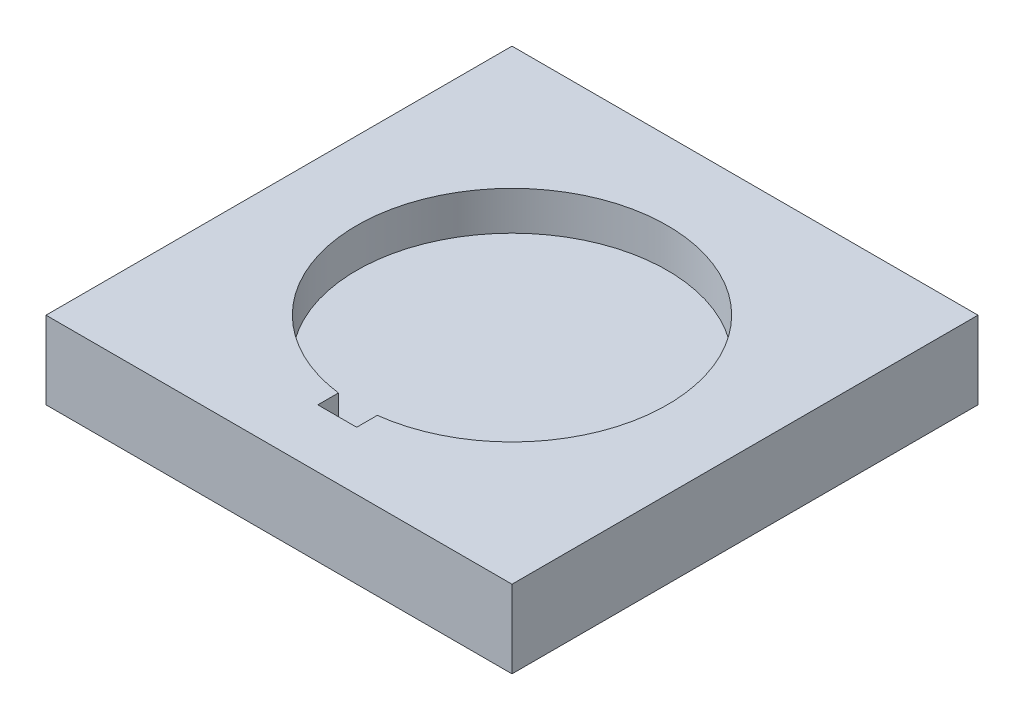
ISO-10303-21;
HEADER;
FILE_DESCRIPTION(('STEP AP214'),'2;1');
FILE_NAME('part.step','',(''),(''),'','','');
FILE_SCHEMA(('AUTOMOTIVE_DESIGN { 1 0 10303 214 1 1 1 1 }'));
ENDSEC;
DATA;
#1=APPLICATION_CONTEXT('core data for automotive mechanical design processes');
#2=APPLICATION_PROTOCOL_DEFINITION('international standard','automotive_design',2000,#1);
#3=PRODUCT_CONTEXT('',#1,'mechanical');
#4=PRODUCT('Part','Part','',(#3));
#5=PRODUCT_RELATED_PRODUCT_CATEGORY('part','',(#4));
#6=PRODUCT_DEFINITION_FORMATION('','',#4);
#7=PRODUCT_DEFINITION_CONTEXT('part definition',#1,'design');
#8=PRODUCT_DEFINITION('design','',#6,#7);
#9=PRODUCT_DEFINITION_SHAPE('','',#8);
#10=(LENGTH_UNIT() NAMED_UNIT(*) SI_UNIT(.MILLI.,.METRE.));
#11=(NAMED_UNIT(*) PLANE_ANGLE_UNIT() SI_UNIT($,.RADIAN.));
#12=(NAMED_UNIT(*) SI_UNIT($,.STERADIAN.) SOLID_ANGLE_UNIT());
#13=UNCERTAINTY_MEASURE_WITH_UNIT(LENGTH_MEASURE(1.E-05),#10,'distance_accuracy_value','');
#14=(GEOMETRIC_REPRESENTATION_CONTEXT(3) GLOBAL_UNCERTAINTY_ASSIGNED_CONTEXT((#13)) GLOBAL_UNIT_ASSIGNED_CONTEXT((#10,
#11,#12)) REPRESENTATION_CONTEXT('',''));
#15=CARTESIAN_POINT('',(0.,0.,0.));
#16=DIRECTION('',(0.,0.,1.));
#17=DIRECTION('',(1.,0.,0.));
#18=AXIS2_PLACEMENT_3D('',#15,#16,#17);
#19=CARTESIAN_POINT('',(-76.2,-25.4,-76.2));
#20=DIRECTION('',(-1.,0.,0.));
#21=DIRECTION('',(0.,0.,1.));
#22=AXIS2_PLACEMENT_3D('',#19,#20,#21);
#23=PLANE('',#22);
#24=DIRECTION('',(0.,0.,1.));
#25=VECTOR('',#24,1.);
#26=CARTESIAN_POINT('',(-76.2,0.,-76.2));
#27=LINE('',#26,#25);
#28=CARTESIAN_POINT('',(-76.2,0.,-76.2));
#29=VERTEX_POINT('',#28);
#30=CARTESIAN_POINT('',(-76.2,0.,76.2));
#31=VERTEX_POINT('',#30);
#32=EDGE_CURVE('E139',#29,#31,#27,.T.);
#33=ORIENTED_EDGE('',*,*,#32,.F.);
#34=DIRECTION('',(0.,1.,0.));
#35=VECTOR('',#34,1.);
#36=CARTESIAN_POINT('',(-76.2,-25.4,-76.2));
#37=LINE('',#36,#35);
#38=CARTESIAN_POINT('',(-76.2,-25.4,-76.2));
#39=VERTEX_POINT('',#38);
#40=EDGE_CURVE('E11',#39,#29,#37,.T.);
#41=ORIENTED_EDGE('',*,*,#40,.F.);
#42=DIRECTION('',(0.,0.,1.));
#43=VECTOR('',#42,1.);
#44=CARTESIAN_POINT('',(-76.2,-25.4,-76.2));
#45=LINE('',#44,#43);
#46=CARTESIAN_POINT('',(-76.2,-25.4,76.2));
#47=VERTEX_POINT('',#46);
#48=EDGE_CURVE('E143',#39,#47,#45,.T.);
#49=ORIENTED_EDGE('',*,*,#48,.T.);
#50=DIRECTION('',(0.,1.,0.));
#51=VECTOR('',#50,1.);
#52=CARTESIAN_POINT('',(-76.2,-25.4,76.2));
#53=LINE('',#52,#51);
#54=EDGE_CURVE('E35',#47,#31,#53,.T.);
#55=ORIENTED_EDGE('',*,*,#54,.T.);
#56=EDGE_LOOP('',(#33,#41,#49,#55));
#57=FACE_BOUND('',#56,.T.);
#58=ADVANCED_FACE('F32',(#57),#23,.T.);
#59=CARTESIAN_POINT('',(-76.2,-25.4,-76.2));
#60=DIRECTION('',(0.,0.,-1.));
#61=DIRECTION('',(-1.,0.,0.));
#62=AXIS2_PLACEMENT_3D('',#59,#60,#61);
#63=PLANE('',#62);
#64=DIRECTION('',(-1.,0.,0.));
#65=VECTOR('',#64,1.);
#66=CARTESIAN_POINT('',(-76.2,0.,-76.2));
#67=LINE('',#66,#65);
#68=CARTESIAN_POINT('',(76.2,0.,-76.2));
#69=VERTEX_POINT('',#68);
#70=EDGE_CURVE('E146',#69,#29,#67,.T.);
#71=ORIENTED_EDGE('',*,*,#70,.F.);
#72=DIRECTION('',(0.,1.,0.));
#73=VECTOR('',#72,1.);
#74=CARTESIAN_POINT('',(76.2,-25.4,-76.2));
#75=LINE('',#74,#73);
#76=CARTESIAN_POINT('',(76.2,-25.4,-76.2));
#77=VERTEX_POINT('',#76);
#78=EDGE_CURVE('E40',#77,#69,#75,.T.);
#79=ORIENTED_EDGE('',*,*,#78,.F.);
#80=DIRECTION('',(-1.,0.,0.));
#81=VECTOR('',#80,1.);
#82=CARTESIAN_POINT('',(-76.2,-25.4,-76.2));
#83=LINE('',#82,#81);
#84=EDGE_CURVE('E151',#77,#39,#83,.T.);
#85=ORIENTED_EDGE('',*,*,#84,.T.);
#86=ORIENTED_EDGE('',*,*,#40,.T.);
#87=EDGE_LOOP('',(#71,#79,#85,#86));
#88=FACE_BOUND('',#87,.T.);
#89=ADVANCED_FACE('F168',(#88),#63,.T.);
#90=CARTESIAN_POINT('',(76.2,-25.4,-76.2));
#91=DIRECTION('',(1.,0.,0.));
#92=DIRECTION('',(0.,0.,-1.));
#93=AXIS2_PLACEMENT_3D('',#90,#91,#92);
#94=PLANE('',#93);
#95=DIRECTION('',(0.,0.,-1.));
#96=VECTOR('',#95,1.);
#97=CARTESIAN_POINT('',(76.2,0.,-76.2));
#98=LINE('',#97,#96);
#99=CARTESIAN_POINT('',(76.2,0.,76.2));
#100=VERTEX_POINT('',#99);
#101=EDGE_CURVE('E158',#100,#69,#98,.T.);
#102=ORIENTED_EDGE('',*,*,#101,.F.);
#103=DIRECTION('',(0.,1.,0.));
#104=VECTOR('',#103,1.);
#105=CARTESIAN_POINT('',(76.2,-25.4,76.2));
#106=LINE('',#105,#104);
#107=CARTESIAN_POINT('',(76.2,-25.4,76.2));
#108=VERTEX_POINT('',#107);
#109=EDGE_CURVE('E163',#108,#100,#106,.T.);
#110=ORIENTED_EDGE('',*,*,#109,.F.);
#111=DIRECTION('',(0.,0.,-1.));
#112=VECTOR('',#111,1.);
#113=CARTESIAN_POINT('',(76.2,-25.4,-76.2));
#114=LINE('',#113,#112);
#115=EDGE_CURVE('E148',#108,#77,#114,.T.);
#116=ORIENTED_EDGE('',*,*,#115,.T.);
#117=ORIENTED_EDGE('',*,*,#78,.T.);
#118=EDGE_LOOP('',(#102,#110,#116,#117));
#119=FACE_BOUND('',#118,.T.);
#120=ADVANCED_FACE('F172',(#119),#94,.T.);
#121=CARTESIAN_POINT('',(-76.2,-25.4,76.2));
#122=DIRECTION('',(0.,0.,1.));
#123=DIRECTION('',(1.,0.,0.));
#124=AXIS2_PLACEMENT_3D('',#121,#122,#123);
#125=PLANE('',#124);
#126=DIRECTION('',(1.,0.,0.));
#127=VECTOR('',#126,1.);
#128=CARTESIAN_POINT('',(-76.2,0.,76.2));
#129=LINE('',#128,#127);
#130=EDGE_CURVE('E155',#31,#100,#129,.T.);
#131=ORIENTED_EDGE('',*,*,#130,.F.);
#132=ORIENTED_EDGE('',*,*,#54,.F.);
#133=DIRECTION('',(1.,0.,0.));
#134=VECTOR('',#133,1.);
#135=CARTESIAN_POINT('',(-76.2,-25.4,76.2));
#136=LINE('',#135,#134);
#137=EDGE_CURVE('E145',#47,#108,#136,.T.);
#138=ORIENTED_EDGE('',*,*,#137,.T.);
#139=ORIENTED_EDGE('',*,*,#109,.T.);
#140=EDGE_LOOP('',(#131,#132,#138,#139));
#141=FACE_BOUND('',#140,.T.);
#142=ADVANCED_FACE('F165',(#141),#125,.T.);
#143=CARTESIAN_POINT('',(0.,-25.4,0.));
#144=DIRECTION('',(0.,1.,0.));
#145=DIRECTION('',(0.,0.,1.));
#146=AXIS2_PLACEMENT_3D('',#143,#144,#145);
#147=PLANE('',#146);
#148=ORIENTED_EDGE('',*,*,#48,.F.);
#149=ORIENTED_EDGE('',*,*,#84,.F.);
#150=ORIENTED_EDGE('',*,*,#115,.F.);
#151=ORIENTED_EDGE('',*,*,#137,.F.);
#152=EDGE_LOOP('',(#148,#149,#150,#151));
#153=FACE_BOUND('',#152,.T.);
#154=ADVANCED_FACE('F174',(#153),#147,.F.);
#155=CARTESIAN_POINT('',(0.,0.,0.));
#156=DIRECTION('',(0.,1.,0.));
#157=DIRECTION('',(0.,0.,1.));
#158=AXIS2_PLACEMENT_3D('',#155,#156,#157);
#159=PLANE('',#158);
#160=CARTESIAN_POINT('',(0.,0.,0.));
#161=DIRECTION('',(0.,1.,0.));
#162=DIRECTION('',(0.,0.,1.));
#163=AXIS2_PLACEMENT_3D('',#160,#161,#162);
#164=CIRCLE('',#163,50.8);
#165=CARTESIAN_POINT('',(6.35,0.,50.4015624757804));
#166=VERTEX_POINT('',#165);
#167=CARTESIAN_POINT('',(-6.35,0.,50.4015624757804));
#168=VERTEX_POINT('',#167);
#169=EDGE_CURVE('E48',#166,#168,#164,.T.);
#170=ORIENTED_EDGE('',*,*,#169,.F.);
#171=DIRECTION('',(0.,0.,-1.));
#172=VECTOR('',#171,1.);
#173=CARTESIAN_POINT('',(6.35,0.,50.4015624757804));
#174=LINE('',#173,#172);
#175=CARTESIAN_POINT('',(6.35,0.,57.15));
#176=VERTEX_POINT('',#175);
#177=EDGE_CURVE('E124',#176,#166,#174,.T.);
#178=ORIENTED_EDGE('',*,*,#177,.F.);
#179=DIRECTION('',(1.,0.,0.));
#180=VECTOR('',#179,1.);
#181=CARTESIAN_POINT('',(-6.35,0.,57.15));
#182=LINE('',#181,#180);
#183=CARTESIAN_POINT('',(-6.35,0.,57.15));
#184=VERTEX_POINT('',#183);
#185=EDGE_CURVE('E127',#184,#176,#182,.T.);
#186=ORIENTED_EDGE('',*,*,#185,.F.);
#187=DIRECTION('',(0.,0.,1.));
#188=VECTOR('',#187,1.);
#189=CARTESIAN_POINT('',(-6.35,0.,50.4015624757804));
#190=LINE('',#189,#188);
#191=EDGE_CURVE('E133',#168,#184,#190,.T.);
#192=ORIENTED_EDGE('',*,*,#191,.F.);
#193=EDGE_LOOP('',(#170,#178,#186,#192));
#194=FACE_BOUND('',#193,.T.);
#195=ORIENTED_EDGE('',*,*,#32,.T.);
#196=ORIENTED_EDGE('',*,*,#130,.T.);
#197=ORIENTED_EDGE('',*,*,#101,.T.);
#198=ORIENTED_EDGE('',*,*,#70,.T.);
#199=EDGE_LOOP('',(#195,#196,#197,#198));
#200=FACE_BOUND('',#199,.T.);
#201=ADVANCED_FACE('F167',(#194,#200),#159,.T.);
#202=CARTESIAN_POINT('',(0.,-12.7,0.));
#203=DIRECTION('',(0.,1.,0.));
#204=DIRECTION('',(0.,0.,1.));
#205=AXIS2_PLACEMENT_3D('',#202,#203,#204);
#206=CYLINDRICAL_SURFACE('',#205,50.8);
#207=ORIENTED_EDGE('',*,*,#169,.T.);
#208=DIRECTION('',(0.,1.,0.));
#209=VECTOR('',#208,1.);
#210=CARTESIAN_POINT('',(-6.35,-12.7,50.4015624757804));
#211=LINE('',#210,#209);
#212=CARTESIAN_POINT('',(-6.35,-12.7,50.4015624757804));
#213=VERTEX_POINT('',#212);
#214=EDGE_CURVE('E102',#213,#168,#211,.T.);
#215=ORIENTED_EDGE('',*,*,#214,.F.);
#216=CARTESIAN_POINT('',(0.,-12.7,0.));
#217=DIRECTION('',(0.,1.,0.));
#218=DIRECTION('',(0.,0.,1.));
#219=AXIS2_PLACEMENT_3D('',#216,#217,#218);
#220=CIRCLE('',#219,50.8);
#221=CARTESIAN_POINT('',(6.35,-12.7,50.4015624757804));
#222=VERTEX_POINT('',#221);
#223=EDGE_CURVE('E106',#222,#213,#220,.T.);
#224=ORIENTED_EDGE('',*,*,#223,.F.);
#225=DIRECTION('',(0.,1.,0.));
#226=VECTOR('',#225,1.);
#227=CARTESIAN_POINT('',(6.35,-12.7,50.4015624757804));
#228=LINE('',#227,#226);
#229=EDGE_CURVE('E137',#222,#166,#228,.T.);
#230=ORIENTED_EDGE('',*,*,#229,.T.);
#231=EDGE_LOOP('',(#207,#215,#224,#230));
#232=FACE_BOUND('',#231,.T.);
#233=ADVANCED_FACE('F104',(#232),#206,.F.);
#234=CARTESIAN_POINT('',(6.35,-12.7,50.4015624757804));
#235=DIRECTION('',(1.,0.,0.));
#236=DIRECTION('',(0.,0.,-1.));
#237=AXIS2_PLACEMENT_3D('',#234,#235,#236);
#238=PLANE('',#237);
#239=ORIENTED_EDGE('',*,*,#177,.T.);
#240=ORIENTED_EDGE('',*,*,#229,.F.);
#241=DIRECTION('',(0.,0.,-1.));
#242=VECTOR('',#241,1.);
#243=CARTESIAN_POINT('',(6.35,-12.7,50.4015624757804));
#244=LINE('',#243,#242);
#245=CARTESIAN_POINT('',(6.35,-12.7,57.15));
#246=VERTEX_POINT('',#245);
#247=EDGE_CURVE('E112',#246,#222,#244,.T.);
#248=ORIENTED_EDGE('',*,*,#247,.F.);
#249=DIRECTION('',(0.,1.,0.));
#250=VECTOR('',#249,1.);
#251=CARTESIAN_POINT('',(6.35,-12.7,57.15));
#252=LINE('',#251,#250);
#253=EDGE_CURVE('E140',#246,#176,#252,.T.);
#254=ORIENTED_EDGE('',*,*,#253,.T.);
#255=EDGE_LOOP('',(#239,#240,#248,#254));
#256=FACE_BOUND('',#255,.T.);
#257=ADVANCED_FACE('F218',(#256),#238,.F.);
#258=CARTESIAN_POINT('',(-6.35,-12.7,57.15));
#259=DIRECTION('',(0.,0.,1.));
#260=DIRECTION('',(1.,0.,0.));
#261=AXIS2_PLACEMENT_3D('',#258,#259,#260);
#262=PLANE('',#261);
#263=ORIENTED_EDGE('',*,*,#185,.T.);
#264=ORIENTED_EDGE('',*,*,#253,.F.);
#265=DIRECTION('',(1.,0.,0.));
#266=VECTOR('',#265,1.);
#267=CARTESIAN_POINT('',(-6.35,-12.7,57.15));
#268=LINE('',#267,#266);
#269=CARTESIAN_POINT('',(-6.35,-12.7,57.15));
#270=VERTEX_POINT('',#269);
#271=EDGE_CURVE('E120',#270,#246,#268,.T.);
#272=ORIENTED_EDGE('',*,*,#271,.F.);
#273=DIRECTION('',(0.,1.,0.));
#274=VECTOR('',#273,1.);
#275=CARTESIAN_POINT('',(-6.35,-12.7,57.15));
#276=LINE('',#275,#274);
#277=EDGE_CURVE('E111',#270,#184,#276,.T.);
#278=ORIENTED_EDGE('',*,*,#277,.T.);
#279=EDGE_LOOP('',(#263,#264,#272,#278));
#280=FACE_BOUND('',#279,.T.);
#281=ADVANCED_FACE('F226',(#280),#262,.F.);
#282=CARTESIAN_POINT('',(-6.35,-12.7,50.4015624757804));
#283=DIRECTION('',(-1.,0.,0.));
#284=DIRECTION('',(0.,0.,1.));
#285=AXIS2_PLACEMENT_3D('',#282,#283,#284);
#286=PLANE('',#285);
#287=ORIENTED_EDGE('',*,*,#191,.T.);
#288=ORIENTED_EDGE('',*,*,#277,.F.);
#289=DIRECTION('',(0.,0.,1.));
#290=VECTOR('',#289,1.);
#291=CARTESIAN_POINT('',(-6.35,-12.7,50.4015624757804));
#292=LINE('',#291,#290);
#293=EDGE_CURVE('E115',#213,#270,#292,.T.);
#294=ORIENTED_EDGE('',*,*,#293,.F.);
#295=ORIENTED_EDGE('',*,*,#214,.T.);
#296=EDGE_LOOP('',(#287,#288,#294,#295));
#297=FACE_BOUND('',#296,.T.);
#298=ADVANCED_FACE('F116',(#297),#286,.F.);
#299=CARTESIAN_POINT('',(0.,-12.7,0.));
#300=DIRECTION('',(0.,1.,0.));
#301=DIRECTION('',(0.,0.,1.));
#302=AXIS2_PLACEMENT_3D('',#299,#300,#301);
#303=PLANE('',#302);
#304=ORIENTED_EDGE('',*,*,#223,.T.);
#305=ORIENTED_EDGE('',*,*,#293,.T.);
#306=ORIENTED_EDGE('',*,*,#271,.T.);
#307=ORIENTED_EDGE('',*,*,#247,.T.);
#308=EDGE_LOOP('',(#304,#305,#306,#307));
#309=FACE_BOUND('',#308,.T.);
#310=ADVANCED_FACE('F122',(#309),#303,.T.);
#311=CLOSED_SHELL('',(#58,#89,#120,#142,#154,#201,#233,#257,#281,#298,#310));
#312=MANIFOLD_SOLID_BREP('B2',#311);
#313=ADVANCED_BREP_SHAPE_REPRESENTATION('',(#18,#312),#14);
#314=SHAPE_DEFINITION_REPRESENTATION(#9,#313);
ENDSEC;
END-ISO-10303-21;
